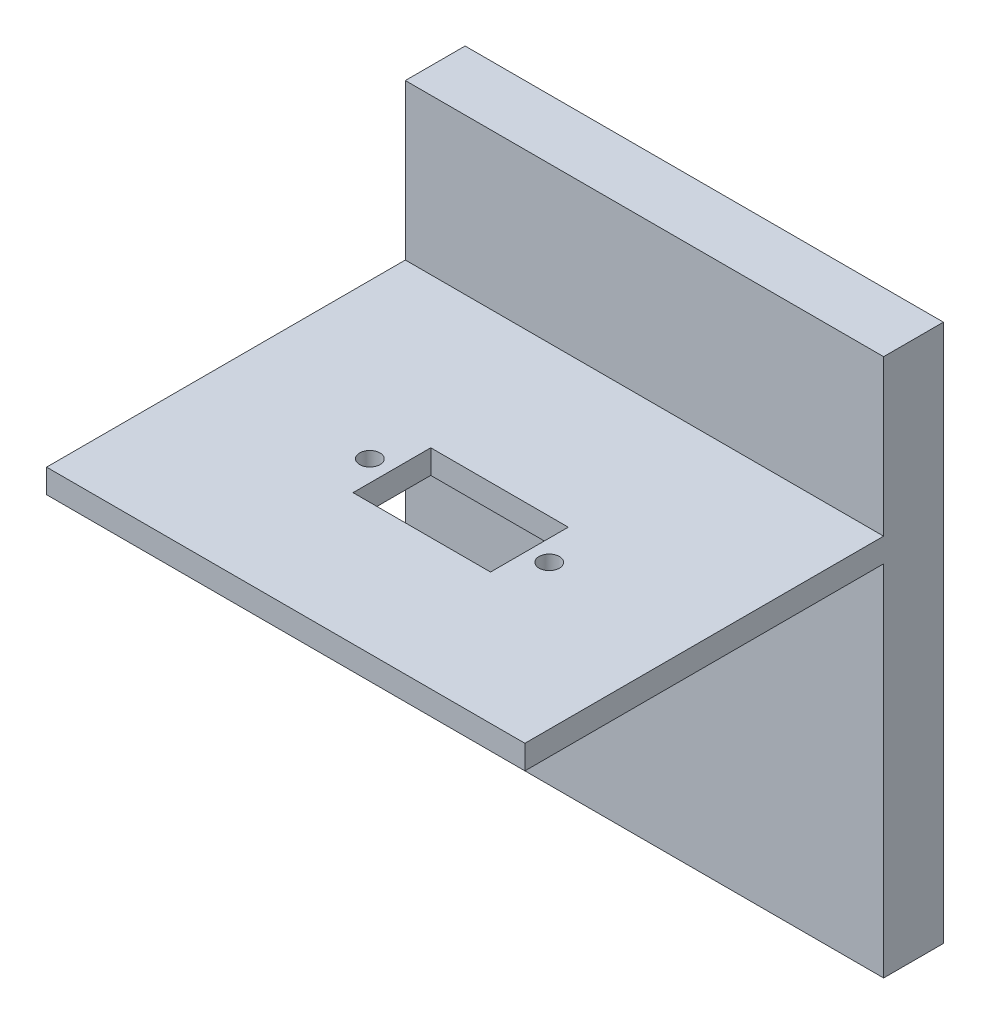
ISO-10303-21;
HEADER;
FILE_DESCRIPTION(('STEP AP214'),'2;1');
FILE_NAME('part.step','',(''),(''),'','','');
FILE_SCHEMA(('AUTOMOTIVE_DESIGN { 1 0 10303 214 1 1 1 1 }'));
ENDSEC;
DATA;
#1=APPLICATION_CONTEXT('core data for automotive mechanical design processes');
#2=APPLICATION_PROTOCOL_DEFINITION('international standard','automotive_design',2000,#1);
#3=PRODUCT_CONTEXT('',#1,'mechanical');
#4=PRODUCT('Part','Part','',(#3));
#5=PRODUCT_RELATED_PRODUCT_CATEGORY('part','',(#4));
#6=PRODUCT_DEFINITION_FORMATION('','',#4);
#7=PRODUCT_DEFINITION_CONTEXT('part definition',#1,'design');
#8=PRODUCT_DEFINITION('design','',#6,#7);
#9=PRODUCT_DEFINITION_SHAPE('','',#8);
#10=(LENGTH_UNIT() NAMED_UNIT(*) SI_UNIT(.MILLI.,.METRE.));
#11=(NAMED_UNIT(*) PLANE_ANGLE_UNIT() SI_UNIT($,.RADIAN.));
#12=(NAMED_UNIT(*) SI_UNIT($,.STERADIAN.) SOLID_ANGLE_UNIT());
#13=UNCERTAINTY_MEASURE_WITH_UNIT(LENGTH_MEASURE(1.E-05),#10,'distance_accuracy_value','');
#14=(GEOMETRIC_REPRESENTATION_CONTEXT(3) GLOBAL_UNCERTAINTY_ASSIGNED_CONTEXT((#13)) GLOBAL_UNIT_ASSIGNED_CONTEXT((#10,
#11,#12)) REPRESENTATION_CONTEXT('',''));
#15=CARTESIAN_POINT('',(0.,0.,0.));
#16=DIRECTION('',(0.,0.,1.));
#17=DIRECTION('',(1.,0.,0.));
#18=AXIS2_PLACEMENT_3D('',#15,#16,#17);
#19=CARTESIAN_POINT('',(0.,0.,10.));
#20=DIRECTION('',(0.,0.,-1.));
#21=DIRECTION('',(-1.,0.,0.));
#22=AXIS2_PLACEMENT_3D('',#19,#20,#21);
#23=PLANE('',#22);
#24=DIRECTION('',(-1.,0.,0.));
#25=VECTOR('',#24,1.);
#26=CARTESIAN_POINT('',(-48.2620817843866,40.3568773234201,10.));
#27=LINE('',#26,#25);
#28=CARTESIAN_POINT('',(31.7379182156134,40.3568773234201,10.));
#29=VERTEX_POINT('',#28);
#30=CARTESIAN_POINT('',(-48.2620817843866,40.3568773234201,10.));
#31=VERTEX_POINT('',#30);
#32=EDGE_CURVE('E173',#29,#31,#27,.T.);
#33=ORIENTED_EDGE('',*,*,#32,.F.);
#34=DIRECTION('',(0.,1.,0.));
#35=VECTOR('',#34,1.);
#36=CARTESIAN_POINT('',(31.7379182156134,-23.6431226765799,10.));
#37=LINE('',#36,#35);
#38=CARTESIAN_POINT('',(31.7379182156134,66.3568773234201,10.));
#39=VERTEX_POINT('',#38);
#40=EDGE_CURVE('E201',#29,#39,#37,.T.);
#41=ORIENTED_EDGE('',*,*,#40,.T.);
#42=DIRECTION('',(-1.,0.,0.));
#43=VECTOR('',#42,1.);
#44=CARTESIAN_POINT('',(-48.2620817843866,66.3568773234201,10.));
#45=LINE('',#44,#43);
#46=CARTESIAN_POINT('',(-48.2620817843866,66.3568773234201,10.));
#47=VERTEX_POINT('',#46);
#48=EDGE_CURVE('E204',#39,#47,#45,.T.);
#49=ORIENTED_EDGE('',*,*,#48,.T.);
#50=DIRECTION('',(0.,-1.,0.));
#51=VECTOR('',#50,1.);
#52=CARTESIAN_POINT('',(-48.2620817843866,36.3568773234201,10.));
#53=LINE('',#52,#51);
#54=EDGE_CURVE('E196',#47,#31,#53,.T.);
#55=ORIENTED_EDGE('',*,*,#54,.T.);
#56=EDGE_LOOP('',(#33,#41,#49,#55));
#57=FACE_BOUND('',#56,.T.);
#58=ADVANCED_FACE('F34',(#57),#23,.F.);
#59=DIRECTION('',(1.,0.,0.));
#60=VECTOR('',#59,1.);
#61=CARTESIAN_POINT('',(-48.2620817843866,36.3568773234201,10.));
#62=LINE('',#61,#60);
#63=CARTESIAN_POINT('',(-48.2620817843866,36.3568773234201,10.));
#64=VERTEX_POINT('',#63);
#65=CARTESIAN_POINT('',(31.7379182156134,36.3568773234201,10.));
#66=VERTEX_POINT('',#65);
#67=EDGE_CURVE('E168',#64,#66,#62,.T.);
#68=ORIENTED_EDGE('',*,*,#67,.F.);
#69=CARTESIAN_POINT('',(-48.2620817843866,-23.6431226765799,10.));
#70=VERTEX_POINT('',#69);
#71=EDGE_CURVE('E199',#64,#70,#53,.T.);
#72=ORIENTED_EDGE('',*,*,#71,.T.);
#73=DIRECTION('',(1.,0.,0.));
#74=VECTOR('',#73,1.);
#75=CARTESIAN_POINT('',(-48.2620817843866,-23.6431226765799,10.));
#76=LINE('',#75,#74);
#77=CARTESIAN_POINT('',(31.7379182156134,-23.6431226765799,10.));
#78=VERTEX_POINT('',#77);
#79=EDGE_CURVE('E198',#70,#78,#76,.T.);
#80=ORIENTED_EDGE('',*,*,#79,.T.);
#81=EDGE_CURVE('E202',#78,#66,#37,.T.);
#82=ORIENTED_EDGE('',*,*,#81,.T.);
#83=EDGE_LOOP('',(#68,#72,#80,#82));
#84=FACE_BOUND('',#83,.T.);
#85=ADVANCED_FACE('F255',(#84),#23,.F.);
#86=CARTESIAN_POINT('',(-48.2620817843866,36.3568773234201,10.));
#87=DIRECTION('',(1.,0.,0.));
#88=DIRECTION('',(0.,1.,0.));
#89=AXIS2_PLACEMENT_3D('',#86,#87,#88);
#90=PLANE('',#89);
#91=DIRECTION('',(0.,-1.,0.));
#92=VECTOR('',#91,1.);
#93=CARTESIAN_POINT('',(-48.2620817843866,36.3568773234201,0.));
#94=LINE('',#93,#92);
#95=CARTESIAN_POINT('',(-48.2620817843866,66.3568773234201,0.));
#96=VERTEX_POINT('',#95);
#97=CARTESIAN_POINT('',(-48.2620817843866,-23.6431226765799,0.));
#98=VERTEX_POINT('',#97);
#99=EDGE_CURVE('E195',#96,#98,#94,.T.);
#100=ORIENTED_EDGE('',*,*,#99,.T.);
#101=DIRECTION('',(0.,0.,-1.));
#102=VECTOR('',#101,1.);
#103=CARTESIAN_POINT('',(-48.2620817843866,-23.6431226765799,10.));
#104=LINE('',#103,#102);
#105=EDGE_CURVE('E11',#70,#98,#104,.T.);
#106=ORIENTED_EDGE('',*,*,#105,.F.);
#107=ORIENTED_EDGE('',*,*,#71,.F.);
#108=DIRECTION('',(0.,0.,-1.));
#109=VECTOR('',#108,1.);
#110=CARTESIAN_POINT('',(-48.2620817843866,36.3568773234201,70.));
#111=LINE('',#110,#109);
#112=CARTESIAN_POINT('',(-48.2620817843866,36.3568773234201,70.));
#113=VERTEX_POINT('',#112);
#114=EDGE_CURVE('E192',#113,#64,#111,.T.);
#115=ORIENTED_EDGE('',*,*,#114,.F.);
#116=DIRECTION('',(0.,-1.,0.));
#117=VECTOR('',#116,1.);
#118=CARTESIAN_POINT('',(-48.2620817843866,36.3568773234201,70.));
#119=LINE('',#118,#117);
#120=CARTESIAN_POINT('',(-48.2620817843866,40.3568773234201,70.));
#121=VERTEX_POINT('',#120);
#122=EDGE_CURVE('E169',#121,#113,#119,.T.);
#123=ORIENTED_EDGE('',*,*,#122,.F.);
#124=DIRECTION('',(0.,0.,-1.));
#125=VECTOR('',#124,1.);
#126=CARTESIAN_POINT('',(-48.2620817843866,40.3568773234201,70.));
#127=LINE('',#126,#125);
#128=EDGE_CURVE('E179',#121,#31,#127,.T.);
#129=ORIENTED_EDGE('',*,*,#128,.T.);
#130=ORIENTED_EDGE('',*,*,#54,.F.);
#131=DIRECTION('',(0.,0.,-1.));
#132=VECTOR('',#131,1.);
#133=CARTESIAN_POINT('',(-48.2620817843866,66.3568773234201,10.));
#134=LINE('',#133,#132);
#135=EDGE_CURVE('E206',#47,#96,#134,.T.);
#136=ORIENTED_EDGE('',*,*,#135,.T.);
#137=EDGE_LOOP('',(#100,#106,#107,#115,#123,#129,#130,#136));
#138=FACE_BOUND('',#137,.T.);
#139=ADVANCED_FACE('F36',(#138),#90,.F.);
#140=CARTESIAN_POINT('',(-48.2620817843866,-23.6431226765799,10.));
#141=DIRECTION('',(0.,1.,0.));
#142=DIRECTION('',(0.,0.,1.));
#143=AXIS2_PLACEMENT_3D('',#140,#141,#142);
#144=PLANE('',#143);
#145=DIRECTION('',(1.,0.,0.));
#146=VECTOR('',#145,1.);
#147=CARTESIAN_POINT('',(-48.2620817843866,-23.6431226765799,0.));
#148=LINE('',#147,#146);
#149=CARTESIAN_POINT('',(31.7379182156134,-23.6431226765799,0.));
#150=VERTEX_POINT('',#149);
#151=EDGE_CURVE('E208',#98,#150,#148,.T.);
#152=ORIENTED_EDGE('',*,*,#151,.T.);
#153=DIRECTION('',(0.,0.,-1.));
#154=VECTOR('',#153,1.);
#155=CARTESIAN_POINT('',(31.7379182156134,-23.6431226765799,10.));
#156=LINE('',#155,#154);
#157=EDGE_CURVE('E42',#78,#150,#156,.T.);
#158=ORIENTED_EDGE('',*,*,#157,.F.);
#159=ORIENTED_EDGE('',*,*,#79,.F.);
#160=ORIENTED_EDGE('',*,*,#105,.T.);
#161=EDGE_LOOP('',(#152,#158,#159,#160));
#162=FACE_BOUND('',#161,.T.);
#163=ADVANCED_FACE('F228',(#162),#144,.F.);
#164=CARTESIAN_POINT('',(31.7379182156134,36.3568773234201,10.));
#165=DIRECTION('',(-1.,0.,0.));
#166=DIRECTION('',(0.,0.,1.));
#167=AXIS2_PLACEMENT_3D('',#164,#165,#166);
#168=PLANE('',#167);
#169=DIRECTION('',(0.,1.,0.));
#170=VECTOR('',#169,1.);
#171=CARTESIAN_POINT('',(31.7379182156134,36.3568773234201,0.));
#172=LINE('',#171,#170);
#173=CARTESIAN_POINT('',(31.7379182156134,66.3568773234201,0.));
#174=VERTEX_POINT('',#173);
#175=EDGE_CURVE('E211',#150,#174,#172,.T.);
#176=ORIENTED_EDGE('',*,*,#175,.T.);
#177=DIRECTION('',(0.,0.,-1.));
#178=VECTOR('',#177,1.);
#179=CARTESIAN_POINT('',(31.7379182156134,66.3568773234201,10.));
#180=LINE('',#179,#178);
#181=EDGE_CURVE('E218',#39,#174,#180,.T.);
#182=ORIENTED_EDGE('',*,*,#181,.F.);
#183=ORIENTED_EDGE('',*,*,#40,.F.);
#184=DIRECTION('',(0.,0.,-1.));
#185=VECTOR('',#184,1.);
#186=CARTESIAN_POINT('',(31.7379182156134,40.3568773234201,70.));
#187=LINE('',#186,#185);
#188=CARTESIAN_POINT('',(31.7379182156134,40.3568773234201,70.));
#189=VERTEX_POINT('',#188);
#190=EDGE_CURVE('E186',#189,#29,#187,.T.);
#191=ORIENTED_EDGE('',*,*,#190,.F.);
#192=DIRECTION('',(0.,1.,0.));
#193=VECTOR('',#192,1.);
#194=CARTESIAN_POINT('',(31.7379182156134,36.3568773234201,70.));
#195=LINE('',#194,#193);
#196=CARTESIAN_POINT('',(31.7379182156134,36.3568773234201,70.));
#197=VERTEX_POINT('',#196);
#198=EDGE_CURVE('E175',#197,#189,#195,.T.);
#199=ORIENTED_EDGE('',*,*,#198,.F.);
#200=DIRECTION('',(0.,0.,-1.));
#201=VECTOR('',#200,1.);
#202=CARTESIAN_POINT('',(31.7379182156134,36.3568773234201,70.));
#203=LINE('',#202,#201);
#204=EDGE_CURVE('E189',#197,#66,#203,.T.);
#205=ORIENTED_EDGE('',*,*,#204,.T.);
#206=ORIENTED_EDGE('',*,*,#81,.F.);
#207=ORIENTED_EDGE('',*,*,#157,.T.);
#208=EDGE_LOOP('',(#176,#182,#183,#191,#199,#205,#206,#207));
#209=FACE_BOUND('',#208,.T.);
#210=ADVANCED_FACE('F224',(#209),#168,.F.);
#211=CARTESIAN_POINT('',(-48.2620817843866,66.3568773234201,10.));
#212=DIRECTION('',(0.,-1.,0.));
#213=DIRECTION('',(0.,0.,-1.));
#214=AXIS2_PLACEMENT_3D('',#211,#212,#213);
#215=PLANE('',#214);
#216=DIRECTION('',(-1.,0.,0.));
#217=VECTOR('',#216,1.);
#218=CARTESIAN_POINT('',(-48.2620817843866,66.3568773234201,0.));
#219=LINE('',#218,#217);
#220=EDGE_CURVE('E213',#174,#96,#219,.T.);
#221=ORIENTED_EDGE('',*,*,#220,.T.);
#222=ORIENTED_EDGE('',*,*,#135,.F.);
#223=ORIENTED_EDGE('',*,*,#48,.F.);
#224=ORIENTED_EDGE('',*,*,#181,.T.);
#225=EDGE_LOOP('',(#221,#222,#223,#224));
#226=FACE_BOUND('',#225,.T.);
#227=ADVANCED_FACE('F236',(#226),#215,.F.);
#228=CARTESIAN_POINT('',(0.,0.,0.));
#229=DIRECTION('',(0.,0.,-1.));
#230=DIRECTION('',(-1.,0.,0.));
#231=AXIS2_PLACEMENT_3D('',#228,#229,#230);
#232=PLANE('',#231);
#233=ORIENTED_EDGE('',*,*,#99,.F.);
#234=ORIENTED_EDGE('',*,*,#220,.F.);
#235=ORIENTED_EDGE('',*,*,#175,.F.);
#236=ORIENTED_EDGE('',*,*,#151,.F.);
#237=EDGE_LOOP('',(#233,#234,#235,#236));
#238=FACE_BOUND('',#237,.T.);
#239=ADVANCED_FACE('F232',(#238),#232,.T.);
#240=CARTESIAN_POINT('',(-48.2620817843866,36.3568773234201,70.));
#241=DIRECTION('',(0.,1.,0.));
#242=DIRECTION('',(0.,0.,1.));
#243=AXIS2_PLACEMENT_3D('',#240,#241,#242);
#244=PLANE('',#243);
#245=CARTESIAN_POINT('',(-22.4378548675244,36.3568773234201,41.7564245368482));
#246=DIRECTION('',(0.,1.,0.));
#247=DIRECTION('',(0.,0.,1.));
#248=AXIS2_PLACEMENT_3D('',#245,#246,#247);
#249=CIRCLE('',#248,1.7);
#250=CARTESIAN_POINT('',(-22.4378548675244,36.3568773234201,43.4564245368481));
#251=VERTEX_POINT('',#250);
#252=EDGE_CURVE('E165',#251,#251,#249,.T.);
#253=ORIENTED_EDGE('',*,*,#252,.T.);
#254=EDGE_LOOP('',(#253));
#255=FACE_BOUND('',#254,.T.);
#256=CARTESIAN_POINT('',(7.56214513247564,36.3568773234201,41.7564245368482));
#257=DIRECTION('',(0.,1.,0.));
#258=DIRECTION('',(0.,0.,1.));
#259=AXIS2_PLACEMENT_3D('',#256,#257,#258);
#260=CIRCLE('',#259,1.7);
#261=CARTESIAN_POINT('',(7.56214513247564,36.3568773234201,43.4564245368481));
#262=VERTEX_POINT('',#261);
#263=EDGE_CURVE('E162',#262,#262,#260,.T.);
#264=ORIENTED_EDGE('',*,*,#263,.T.);
#265=EDGE_LOOP('',(#264));
#266=FACE_BOUND('',#265,.T.);
#267=DIRECTION('',(-1.,0.,0.));
#268=VECTOR('',#267,1.);
#269=CARTESIAN_POINT('',(-48.2620817843866,36.3568773234201,35.0699732211467));
#270=LINE('',#269,#268);
#271=CARTESIAN_POINT('',(4.06214513247564,36.3568773234201,35.0699732211467));
#272=VERTEX_POINT('',#271);
#273=CARTESIAN_POINT('',(-18.9378548675244,36.3568773234201,35.0699732211467));
#274=VERTEX_POINT('',#273);
#275=EDGE_CURVE('E156',#272,#274,#270,.T.);
#276=ORIENTED_EDGE('',*,*,#275,.T.);
#277=DIRECTION('',(0.,0.,1.));
#278=VECTOR('',#277,1.);
#279=CARTESIAN_POINT('',(-18.9378548675244,36.3568773234201,70.));
#280=LINE('',#279,#278);
#281=CARTESIAN_POINT('',(-18.9378548675244,36.3568773234201,48.0699732211467));
#282=VERTEX_POINT('',#281);
#283=EDGE_CURVE('E159',#274,#282,#280,.T.);
#284=ORIENTED_EDGE('',*,*,#283,.T.);
#285=DIRECTION('',(1.,0.,0.));
#286=VECTOR('',#285,1.);
#287=CARTESIAN_POINT('',(-48.2620817843866,36.3568773234201,48.0699732211467));
#288=LINE('',#287,#286);
#289=CARTESIAN_POINT('',(4.06214513247564,36.3568773234201,48.0699732211467));
#290=VERTEX_POINT('',#289);
#291=EDGE_CURVE('E152',#282,#290,#288,.T.);
#292=ORIENTED_EDGE('',*,*,#291,.T.);
#293=DIRECTION('',(0.,0.,-1.));
#294=VECTOR('',#293,1.);
#295=CARTESIAN_POINT('',(4.06214513247564,36.3568773234201,70.));
#296=LINE('',#295,#294);
#297=EDGE_CURVE('E129',#290,#272,#296,.T.);
#298=ORIENTED_EDGE('',*,*,#297,.T.);
#299=EDGE_LOOP('',(#276,#284,#292,#298));
#300=FACE_BOUND('',#299,.T.);
#301=ORIENTED_EDGE('',*,*,#67,.T.);
#302=ORIENTED_EDGE('',*,*,#204,.F.);
#303=DIRECTION('',(1.,0.,0.));
#304=VECTOR('',#303,1.);
#305=CARTESIAN_POINT('',(-48.2620817843866,36.3568773234201,70.));
#306=LINE('',#305,#304);
#307=EDGE_CURVE('E172',#113,#197,#306,.T.);
#308=ORIENTED_EDGE('',*,*,#307,.F.);
#309=ORIENTED_EDGE('',*,*,#114,.T.);
#310=EDGE_LOOP('',(#301,#302,#308,#309));
#311=FACE_BOUND('',#310,.T.);
#312=ADVANCED_FACE('F252',(#255,#266,#300,#311),#244,.F.);
#313=CARTESIAN_POINT('',(-48.2620817843866,40.3568773234201,70.));
#314=DIRECTION('',(0.,-1.,0.));
#315=DIRECTION('',(0.,0.,-1.));
#316=AXIS2_PLACEMENT_3D('',#313,#314,#315);
#317=PLANE('',#316);
#318=CARTESIAN_POINT('',(-22.4378548675244,40.3568773234201,41.7564245368482));
#319=DIRECTION('',(0.,1.,0.));
#320=DIRECTION('',(0.,0.,1.));
#321=AXIS2_PLACEMENT_3D('',#318,#319,#320);
#322=CIRCLE('',#321,1.7);
#323=CARTESIAN_POINT('',(-22.4378548675244,40.3568773234201,43.4564245368481));
#324=VERTEX_POINT('',#323);
#325=EDGE_CURVE('E154',#324,#324,#322,.T.);
#326=ORIENTED_EDGE('',*,*,#325,.F.);
#327=EDGE_LOOP('',(#326));
#328=FACE_BOUND('',#327,.T.);
#329=CARTESIAN_POINT('',(7.56214513247564,40.3568773234201,41.7564245368482));
#330=DIRECTION('',(0.,1.,0.));
#331=DIRECTION('',(0.,0.,1.));
#332=AXIS2_PLACEMENT_3D('',#329,#330,#331);
#333=CIRCLE('',#332,1.7);
#334=CARTESIAN_POINT('',(7.56214513247564,40.3568773234201,43.4564245368481));
#335=VERTEX_POINT('',#334);
#336=EDGE_CURVE('E149',#335,#335,#333,.T.);
#337=ORIENTED_EDGE('',*,*,#336,.F.);
#338=EDGE_LOOP('',(#337));
#339=FACE_BOUND('',#338,.T.);
#340=DIRECTION('',(1.,0.,0.));
#341=VECTOR('',#340,1.);
#342=CARTESIAN_POINT('',(-18.9378548675244,40.3568773234201,48.0699732211467));
#343=LINE('',#342,#341);
#344=CARTESIAN_POINT('',(-18.9378548675244,40.3568773234201,48.0699732211467));
#345=VERTEX_POINT('',#344);
#346=CARTESIAN_POINT('',(4.06214513247564,40.3568773234201,48.0699732211467));
#347=VERTEX_POINT('',#346);
#348=EDGE_CURVE('E135',#345,#347,#343,.T.);
#349=ORIENTED_EDGE('',*,*,#348,.F.);
#350=DIRECTION('',(0.,0.,1.));
#351=VECTOR('',#350,1.);
#352=CARTESIAN_POINT('',(-18.9378548675244,40.3568773234201,48.0699732211467));
#353=LINE('',#352,#351);
#354=CARTESIAN_POINT('',(-18.9378548675244,40.3568773234201,35.0699732211467));
#355=VERTEX_POINT('',#354);
#356=EDGE_CURVE('E57',#355,#345,#353,.T.);
#357=ORIENTED_EDGE('',*,*,#356,.F.);
#358=DIRECTION('',(-1.,0.,0.));
#359=VECTOR('',#358,1.);
#360=CARTESIAN_POINT('',(-18.9378548675244,40.3568773234201,35.0699732211467));
#361=LINE('',#360,#359);
#362=CARTESIAN_POINT('',(4.06214513247564,40.3568773234201,35.0699732211467));
#363=VERTEX_POINT('',#362);
#364=EDGE_CURVE('E142',#363,#355,#361,.T.);
#365=ORIENTED_EDGE('',*,*,#364,.F.);
#366=DIRECTION('',(0.,0.,-1.));
#367=VECTOR('',#366,1.);
#368=CARTESIAN_POINT('',(4.06214513247564,40.3568773234201,48.0699732211467));
#369=LINE('',#368,#367);
#370=EDGE_CURVE('E126',#347,#363,#369,.T.);
#371=ORIENTED_EDGE('',*,*,#370,.F.);
#372=EDGE_LOOP('',(#349,#357,#365,#371));
#373=FACE_BOUND('',#372,.T.);
#374=ORIENTED_EDGE('',*,*,#32,.T.);
#375=ORIENTED_EDGE('',*,*,#128,.F.);
#376=DIRECTION('',(-1.,0.,0.));
#377=VECTOR('',#376,1.);
#378=CARTESIAN_POINT('',(-48.2620817843866,40.3568773234201,70.));
#379=LINE('',#378,#377);
#380=EDGE_CURVE('E177',#189,#121,#379,.T.);
#381=ORIENTED_EDGE('',*,*,#380,.F.);
#382=ORIENTED_EDGE('',*,*,#190,.T.);
#383=EDGE_LOOP('',(#374,#375,#381,#382));
#384=FACE_BOUND('',#383,.T.);
#385=ADVANCED_FACE('F139',(#328,#339,#373,#384),#317,.F.);
#386=CARTESIAN_POINT('',(0.,0.,70.));
#387=DIRECTION('',(0.,0.,-1.));
#388=DIRECTION('',(-1.,0.,0.));
#389=AXIS2_PLACEMENT_3D('',#386,#387,#388);
#390=PLANE('',#389);
#391=ORIENTED_EDGE('',*,*,#122,.T.);
#392=ORIENTED_EDGE('',*,*,#307,.T.);
#393=ORIENTED_EDGE('',*,*,#198,.T.);
#394=ORIENTED_EDGE('',*,*,#380,.T.);
#395=EDGE_LOOP('',(#391,#392,#393,#394));
#396=FACE_BOUND('',#395,.T.);
#397=ADVANCED_FACE('F249',(#396),#390,.F.);
#398=CARTESIAN_POINT('',(-18.9378548675244,30.3568773234201,48.0699732211467));
#399=DIRECTION('',(-1.,0.,0.));
#400=DIRECTION('',(0.,0.,1.));
#401=AXIS2_PLACEMENT_3D('',#398,#399,#400);
#402=PLANE('',#401);
#403=DIRECTION('',(0.,1.,0.));
#404=VECTOR('',#403,1.);
#405=CARTESIAN_POINT('',(-18.9378548675244,30.3568773234201,35.0699732211467));
#406=LINE('',#405,#404);
#407=EDGE_CURVE('E147',#274,#355,#406,.T.);
#408=ORIENTED_EDGE('',*,*,#407,.T.);
#409=ORIENTED_EDGE('',*,*,#356,.T.);
#410=DIRECTION('',(0.,1.,0.));
#411=VECTOR('',#410,1.);
#412=CARTESIAN_POINT('',(-18.9378548675244,30.3568773234201,48.0699732211467));
#413=LINE('',#412,#411);
#414=EDGE_CURVE('E132',#282,#345,#413,.T.);
#415=ORIENTED_EDGE('',*,*,#414,.F.);
#416=ORIENTED_EDGE('',*,*,#283,.F.);
#417=EDGE_LOOP('',(#408,#409,#415,#416));
#418=FACE_BOUND('',#417,.T.);
#419=ADVANCED_FACE('F307',(#418),#402,.F.);
#420=CARTESIAN_POINT('',(-18.9378548675244,30.3568773234201,35.0699732211467));
#421=DIRECTION('',(0.,0.,-1.));
#422=DIRECTION('',(-1.,0.,0.));
#423=AXIS2_PLACEMENT_3D('',#420,#421,#422);
#424=PLANE('',#423);
#425=DIRECTION('',(0.,1.,0.));
#426=VECTOR('',#425,1.);
#427=CARTESIAN_POINT('',(4.06214513247564,30.3568773234201,35.0699732211467));
#428=LINE('',#427,#426);
#429=EDGE_CURVE('E131',#272,#363,#428,.T.);
#430=ORIENTED_EDGE('',*,*,#429,.T.);
#431=ORIENTED_EDGE('',*,*,#364,.T.);
#432=ORIENTED_EDGE('',*,*,#407,.F.);
#433=ORIENTED_EDGE('',*,*,#275,.F.);
#434=EDGE_LOOP('',(#430,#431,#432,#433));
#435=FACE_BOUND('',#434,.T.);
#436=ADVANCED_FACE('F313',(#435),#424,.F.);
#437=CARTESIAN_POINT('',(4.06214513247564,30.3568773234201,48.0699732211467));
#438=DIRECTION('',(1.,0.,0.));
#439=DIRECTION('',(0.,0.,-1.));
#440=AXIS2_PLACEMENT_3D('',#437,#438,#439);
#441=PLANE('',#440);
#442=DIRECTION('',(0.,1.,0.));
#443=VECTOR('',#442,1.);
#444=CARTESIAN_POINT('',(4.06214513247564,30.3568773234201,48.0699732211467));
#445=LINE('',#444,#443);
#446=EDGE_CURVE('E49',#290,#347,#445,.T.);
#447=ORIENTED_EDGE('',*,*,#446,.T.);
#448=ORIENTED_EDGE('',*,*,#370,.T.);
#449=ORIENTED_EDGE('',*,*,#429,.F.);
#450=ORIENTED_EDGE('',*,*,#297,.F.);
#451=EDGE_LOOP('',(#447,#448,#449,#450));
#452=FACE_BOUND('',#451,.T.);
#453=ADVANCED_FACE('F123',(#452),#441,.F.);
#454=CARTESIAN_POINT('',(-18.9378548675244,30.3568773234201,48.0699732211467));
#455=DIRECTION('',(0.,0.,1.));
#456=DIRECTION('',(1.,0.,0.));
#457=AXIS2_PLACEMENT_3D('',#454,#455,#456);
#458=PLANE('',#457);
#459=ORIENTED_EDGE('',*,*,#414,.T.);
#460=ORIENTED_EDGE('',*,*,#348,.T.);
#461=ORIENTED_EDGE('',*,*,#446,.F.);
#462=ORIENTED_EDGE('',*,*,#291,.F.);
#463=EDGE_LOOP('',(#459,#460,#461,#462));
#464=FACE_BOUND('',#463,.T.);
#465=ADVANCED_FACE('F136',(#464),#458,.F.);
#466=CARTESIAN_POINT('',(7.56214513247564,30.3568773234201,41.7564245368482));
#467=DIRECTION('',(0.,1.,0.));
#468=DIRECTION('',(0.,0.,1.));
#469=AXIS2_PLACEMENT_3D('',#466,#467,#468);
#470=CYLINDRICAL_SURFACE('',#469,1.7);
#471=ORIENTED_EDGE('',*,*,#336,.T.);
#472=EDGE_LOOP('',(#471));
#473=FACE_BOUND('',#472,.T.);
#474=ORIENTED_EDGE('',*,*,#263,.F.);
#475=EDGE_LOOP('',(#474));
#476=FACE_BOUND('',#475,.T.);
#477=ADVANCED_FACE('F333',(#473,#476),#470,.F.);
#478=CARTESIAN_POINT('',(-22.4378548675244,30.3568773234201,41.7564245368482));
#479=DIRECTION('',(0.,1.,0.));
#480=DIRECTION('',(0.,0.,1.));
#481=AXIS2_PLACEMENT_3D('',#478,#479,#480);
#482=CYLINDRICAL_SURFACE('',#481,1.7);
#483=ORIENTED_EDGE('',*,*,#325,.T.);
#484=EDGE_LOOP('',(#483));
#485=FACE_BOUND('',#484,.T.);
#486=ORIENTED_EDGE('',*,*,#252,.F.);
#487=EDGE_LOOP('',(#486));
#488=FACE_BOUND('',#487,.T.);
#489=ADVANCED_FACE('F340',(#485,#488),#482,.F.);
#490=CLOSED_SHELL('',(#58,#85,#139,#163,#210,#227,#239,#312,#385,#397,#419,#436,#453,#465,#477,#489));
#491=MANIFOLD_SOLID_BREP('B2',#490);
#492=ADVANCED_BREP_SHAPE_REPRESENTATION('',(#18,#491),#14);
#493=SHAPE_DEFINITION_REPRESENTATION(#9,#492);
ENDSEC;
END-ISO-10303-21;
